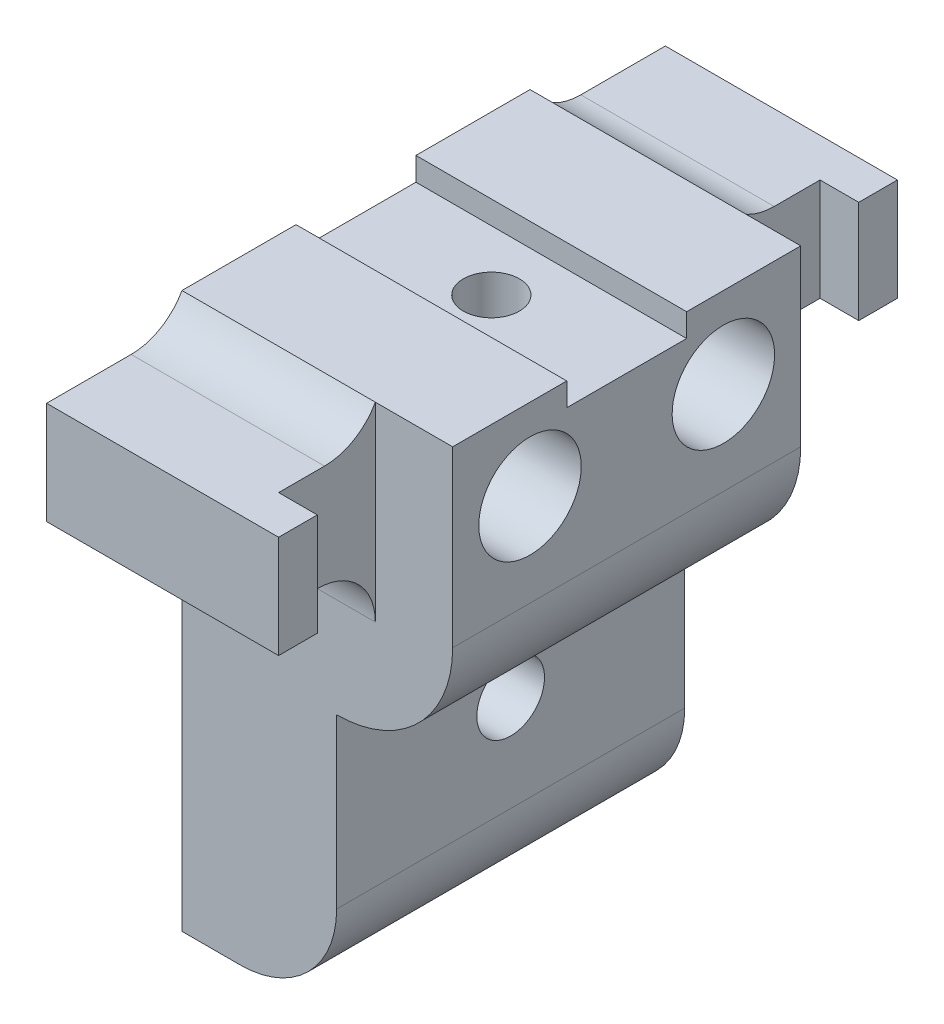
ISO-10303-21;
HEADER;
FILE_DESCRIPTION(('STEP AP214'),'2;1');
FILE_NAME('part.step','',(''),(''),'','','');
FILE_SCHEMA(('AUTOMOTIVE_DESIGN { 1 0 10303 214 1 1 1 1 }'));
ENDSEC;
DATA;
#1=APPLICATION_CONTEXT('core data for automotive mechanical design processes');
#2=APPLICATION_PROTOCOL_DEFINITION('international standard','automotive_design',2000,#1);
#3=PRODUCT_CONTEXT('',#1,'mechanical');
#4=PRODUCT('Part','Part','',(#3));
#5=PRODUCT_RELATED_PRODUCT_CATEGORY('part','',(#4));
#6=PRODUCT_DEFINITION_FORMATION('','',#4);
#7=PRODUCT_DEFINITION_CONTEXT('part definition',#1,'design');
#8=PRODUCT_DEFINITION('design','',#6,#7);
#9=PRODUCT_DEFINITION_SHAPE('','',#8);
#10=(LENGTH_UNIT() NAMED_UNIT(*) SI_UNIT(.MILLI.,.METRE.));
#11=(NAMED_UNIT(*) PLANE_ANGLE_UNIT() SI_UNIT($,.RADIAN.));
#12=(NAMED_UNIT(*) SI_UNIT($,.STERADIAN.) SOLID_ANGLE_UNIT());
#13=UNCERTAINTY_MEASURE_WITH_UNIT(LENGTH_MEASURE(1.E-05),#10,'distance_accuracy_value','');
#14=(GEOMETRIC_REPRESENTATION_CONTEXT(3) GLOBAL_UNCERTAINTY_ASSIGNED_CONTEXT((#13)) GLOBAL_UNIT_ASSIGNED_CONTEXT((#10,
#11,#12)) REPRESENTATION_CONTEXT('',''));
#15=CARTESIAN_POINT('',(0.,0.,0.));
#16=DIRECTION('',(0.,0.,1.));
#17=DIRECTION('',(1.,0.,0.));
#18=AXIS2_PLACEMENT_3D('',#15,#16,#17);
#19=CARTESIAN_POINT('',(0.,0.,9.));
#20=DIRECTION('',(0.,1.,0.));
#21=DIRECTION('',(0.,0.,1.));
#22=AXIS2_PLACEMENT_3D('',#19,#20,#21);
#23=PLANE('',#22);
#24=DIRECTION('',(-1.,0.,0.));
#25=VECTOR('',#24,1.);
#26=CARTESIAN_POINT('',(0.,0.,-3.1));
#27=LINE('',#26,#25);
#28=CARTESIAN_POINT('',(14.,0.,-3.1));
#29=VERTEX_POINT('',#28);
#30=CARTESIAN_POINT('',(0.,0.,-3.1));
#31=VERTEX_POINT('',#30);
#32=EDGE_CURVE('E235',#29,#31,#27,.T.);
#33=ORIENTED_EDGE('',*,*,#32,.F.);
#34=DIRECTION('',(0.,0.,-1.));
#35=VECTOR('',#34,1.);
#36=CARTESIAN_POINT('',(14.,0.,9.));
#37=LINE('',#36,#35);
#38=CARTESIAN_POINT('',(14.,0.,-9.));
#39=VERTEX_POINT('',#38);
#40=EDGE_CURVE('E428',#29,#39,#37,.T.);
#41=ORIENTED_EDGE('',*,*,#40,.T.);
#42=DIRECTION('',(1.,0.,0.));
#43=VECTOR('',#42,1.);
#44=CARTESIAN_POINT('',(0.,0.,-9.));
#45=LINE('',#44,#43);
#46=CARTESIAN_POINT('',(10.,0.,-9.));
#47=VERTEX_POINT('',#46);
#48=EDGE_CURVE('E403',#47,#39,#45,.T.);
#49=ORIENTED_EDGE('',*,*,#48,.F.);
#50=CARTESIAN_POINT('',(0.,0.,-9.));
#51=VERTEX_POINT('',#50);
#52=EDGE_CURVE('E404',#51,#47,#45,.T.);
#53=ORIENTED_EDGE('',*,*,#52,.F.);
#54=DIRECTION('',(0.,0.,-1.));
#55=VECTOR('',#54,1.);
#56=CARTESIAN_POINT('',(0.,0.,9.));
#57=LINE('',#56,#55);
#58=EDGE_CURVE('E425',#31,#51,#57,.T.);
#59=ORIENTED_EDGE('',*,*,#58,.F.);
#60=EDGE_LOOP('',(#33,#41,#49,#53,#59));
#61=FACE_BOUND('',#60,.T.);
#62=ADVANCED_FACE('F41',(#61),#23,.T.);
#63=CARTESIAN_POINT('',(14.,0.,9.));
#64=DIRECTION('',(1.,0.,0.));
#65=DIRECTION('',(0.,1.,0.));
#66=AXIS2_PLACEMENT_3D('',#63,#64,#65);
#67=PLANE('',#66);
#68=DIRECTION('',(0.,-1.,0.));
#69=VECTOR('',#68,1.);
#70=CARTESIAN_POINT('',(14.,0.,9.));
#71=LINE('',#70,#69);
#72=CARTESIAN_POINT('',(14.,0.,9.));
#73=VERTEX_POINT('',#72);
#74=CARTESIAN_POINT('',(14.,-9.,9.));
#75=VERTEX_POINT('',#74);
#76=EDGE_CURVE('E378',#73,#75,#71,.T.);
#77=ORIENTED_EDGE('',*,*,#76,.T.);
#78=DIRECTION('',(0.,0.,-1.));
#79=VECTOR('',#78,1.);
#80=CARTESIAN_POINT('',(14.,-9.,-9.));
#81=LINE('',#80,#79);
#82=CARTESIAN_POINT('',(14.,-9.,-9.));
#83=VERTEX_POINT('',#82);
#84=EDGE_CURVE('E451',#75,#83,#81,.T.);
#85=ORIENTED_EDGE('',*,*,#84,.T.);
#86=DIRECTION('',(0.,-1.,0.));
#87=VECTOR('',#86,1.);
#88=CARTESIAN_POINT('',(14.,0.,-9.));
#89=LINE('',#88,#87);
#90=EDGE_CURVE('E366',#39,#83,#89,.T.);
#91=ORIENTED_EDGE('',*,*,#90,.F.);
#92=ORIENTED_EDGE('',*,*,#40,.F.);
#93=DIRECTION('',(0.,1.,0.));
#94=VECTOR('',#93,1.);
#95=CARTESIAN_POINT('',(14.,-1.2,-3.1));
#96=LINE('',#95,#94);
#97=CARTESIAN_POINT('',(14.,-1.2,-3.1));
#98=VERTEX_POINT('',#97);
#99=EDGE_CURVE('E245',#98,#29,#96,.T.);
#100=ORIENTED_EDGE('',*,*,#99,.F.);
#101=DIRECTION('',(0.,0.,-1.));
#102=VECTOR('',#101,1.);
#103=CARTESIAN_POINT('',(14.,-1.2,-3.1));
#104=LINE('',#103,#102);
#105=CARTESIAN_POINT('',(14.,-1.2,3.1));
#106=VERTEX_POINT('',#105);
#107=EDGE_CURVE('E225',#106,#98,#104,.T.);
#108=ORIENTED_EDGE('',*,*,#107,.F.);
#109=DIRECTION('',(0.,1.,0.));
#110=VECTOR('',#109,1.);
#111=CARTESIAN_POINT('',(14.,-1.2,3.1));
#112=LINE('',#111,#110);
#113=CARTESIAN_POINT('',(14.,0.,3.1));
#114=VERTEX_POINT('',#113);
#115=EDGE_CURVE('E221',#106,#114,#112,.T.);
#116=ORIENTED_EDGE('',*,*,#115,.T.);
#117=EDGE_CURVE('E429',#73,#114,#37,.T.);
#118=ORIENTED_EDGE('',*,*,#117,.F.);
#119=EDGE_LOOP('',(#77,#85,#91,#92,#100,#108,#116,#118));
#120=FACE_BOUND('',#119,.T.);
#121=CARTESIAN_POINT('',(14.,-4.2,-5.));
#122=DIRECTION('',(1.,0.,0.));
#123=DIRECTION('',(0.,1.,0.));
#124=AXIS2_PLACEMENT_3D('',#121,#122,#123);
#125=CIRCLE('',#124,2.65);
#126=CARTESIAN_POINT('',(14.,-1.55,-5.));
#127=VERTEX_POINT('',#126);
#128=EDGE_CURVE('E367',#127,#127,#125,.T.);
#129=ORIENTED_EDGE('',*,*,#128,.F.);
#130=EDGE_LOOP('',(#129));
#131=FACE_BOUND('',#130,.T.);
#132=CARTESIAN_POINT('',(14.,-4.2,5.));
#133=DIRECTION('',(1.,0.,0.));
#134=DIRECTION('',(0.,1.,0.));
#135=AXIS2_PLACEMENT_3D('',#132,#133,#134);
#136=CIRCLE('',#135,2.65);
#137=CARTESIAN_POINT('',(14.,-1.55,5.));
#138=VERTEX_POINT('',#137);
#139=EDGE_CURVE('E361',#138,#138,#136,.T.);
#140=ORIENTED_EDGE('',*,*,#139,.F.);
#141=EDGE_LOOP('',(#140));
#142=FACE_BOUND('',#141,.T.);
#143=ADVANCED_FACE('F529',(#120,#131,#142),#67,.T.);
#144=DIRECTION('',(1.,0.,0.));
#145=VECTOR('',#144,1.);
#146=CARTESIAN_POINT('',(0.,0.,3.1));
#147=LINE('',#146,#145);
#148=CARTESIAN_POINT('',(0.,0.,3.1));
#149=VERTEX_POINT('',#148);
#150=EDGE_CURVE('E887',#149,#114,#147,.T.);
#151=ORIENTED_EDGE('',*,*,#150,.F.);
#152=CARTESIAN_POINT('',(0.,0.,9.));
#153=VERTEX_POINT('',#152);
#154=EDGE_CURVE('E240',#153,#149,#57,.T.);
#155=ORIENTED_EDGE('',*,*,#154,.F.);
#156=DIRECTION('',(1.,0.,0.));
#157=VECTOR('',#156,1.);
#158=CARTESIAN_POINT('',(0.,0.,9.));
#159=LINE('',#158,#157);
#160=CARTESIAN_POINT('',(10.,0.,9.));
#161=VERTEX_POINT('',#160);
#162=EDGE_CURVE('E384',#153,#161,#159,.T.);
#163=ORIENTED_EDGE('',*,*,#162,.T.);
#164=EDGE_CURVE('E382',#161,#73,#159,.T.);
#165=ORIENTED_EDGE('',*,*,#164,.T.);
#166=ORIENTED_EDGE('',*,*,#117,.T.);
#167=EDGE_LOOP('',(#151,#155,#163,#165,#166));
#168=FACE_BOUND('',#167,.T.);
#169=ADVANCED_FACE('F538',(#168),#23,.T.);
#170=CARTESIAN_POINT('',(0.,0.,9.));
#171=DIRECTION('',(1.,0.,0.));
#172=DIRECTION('',(0.,1.,0.));
#173=AXIS2_PLACEMENT_3D('',#170,#171,#172);
#174=PLANE('',#173);
#175=CARTESIAN_POINT('',(0.,-18.7,0.));
#176=DIRECTION('',(1.,0.,0.));
#177=DIRECTION('',(0.,1.,0.));
#178=AXIS2_PLACEMENT_3D('',#175,#176,#177);
#179=CIRCLE('',#178,1.75);
#180=CARTESIAN_POINT('',(0.,-16.95,0.));
#181=VERTEX_POINT('',#180);
#182=EDGE_CURVE('E438',#181,#181,#179,.T.);
#183=ORIENTED_EDGE('',*,*,#182,.T.);
#184=EDGE_LOOP('',(#183));
#185=FACE_BOUND('',#184,.T.);
#186=CARTESIAN_POINT('',(0.,-4.2,-5.));
#187=DIRECTION('',(1.,0.,0.));
#188=DIRECTION('',(0.,1.,0.));
#189=AXIS2_PLACEMENT_3D('',#186,#187,#188);
#190=CIRCLE('',#189,2.65);
#191=CARTESIAN_POINT('',(0.,-1.55,-5.));
#192=VERTEX_POINT('',#191);
#193=EDGE_CURVE('E362',#192,#192,#190,.T.);
#194=ORIENTED_EDGE('',*,*,#193,.T.);
#195=EDGE_LOOP('',(#194));
#196=FACE_BOUND('',#195,.T.);
#197=CARTESIAN_POINT('',(0.,-4.2,5.));
#198=DIRECTION('',(1.,0.,0.));
#199=DIRECTION('',(0.,1.,0.));
#200=AXIS2_PLACEMENT_3D('',#197,#198,#199);
#201=CIRCLE('',#200,2.65);
#202=CARTESIAN_POINT('',(0.,-1.55,5.));
#203=VERTEX_POINT('',#202);
#204=EDGE_CURVE('E371',#203,#203,#201,.T.);
#205=ORIENTED_EDGE('',*,*,#204,.T.);
#206=EDGE_LOOP('',(#205));
#207=FACE_BOUND('',#206,.T.);
#208=DIRECTION('',(0.,0.,1.));
#209=VECTOR('',#208,1.);
#210=CARTESIAN_POINT('',(0.,-1.2,-3.1));
#211=LINE('',#210,#209);
#212=CARTESIAN_POINT('',(0.,-1.2,-3.1));
#213=VERTEX_POINT('',#212);
#214=CARTESIAN_POINT('',(0.,-1.2,3.1));
#215=VERTEX_POINT('',#214);
#216=EDGE_CURVE('E226',#213,#215,#211,.T.);
#217=ORIENTED_EDGE('',*,*,#216,.F.);
#218=DIRECTION('',(0.,1.,0.));
#219=VECTOR('',#218,1.);
#220=CARTESIAN_POINT('',(0.,-1.2,-3.1));
#221=LINE('',#220,#219);
#222=EDGE_CURVE('E272',#213,#31,#221,.T.);
#223=ORIENTED_EDGE('',*,*,#222,.T.);
#224=ORIENTED_EDGE('',*,*,#58,.T.);
#225=CARTESIAN_POINT('',(0.,1.45,-11.6263091973338));
#226=DIRECTION('',(1.,0.,0.));
#227=DIRECTION('',(0.,1.,0.));
#228=AXIS2_PLACEMENT_3D('',#225,#226,#227);
#229=CIRCLE('',#228,3.);
#230=CARTESIAN_POINT('',(0.,-1.55,-11.6263091973338));
#231=VERTEX_POINT('',#230);
#232=EDGE_CURVE('E481',#51,#231,#229,.T.);
#233=ORIENTED_EDGE('',*,*,#232,.T.);
#234=DIRECTION('',(0.,0.,1.));
#235=VECTOR('',#234,1.);
#236=CARTESIAN_POINT('',(0.,-1.55,-14.));
#237=LINE('',#236,#235);
#238=CARTESIAN_POINT('',(0.,-1.55,-16.));
#239=VERTEX_POINT('',#238);
#240=EDGE_CURVE('E303',#239,#231,#237,.T.);
#241=ORIENTED_EDGE('',*,*,#240,.F.);
#242=DIRECTION('',(0.,-1.,0.));
#243=VECTOR('',#242,1.);
#244=CARTESIAN_POINT('',(0.,-1.55,-16.));
#245=LINE('',#244,#243);
#246=CARTESIAN_POINT('',(0.,-6.85,-16.));
#247=VERTEX_POINT('',#246);
#248=EDGE_CURVE('E250',#239,#247,#245,.T.);
#249=ORIENTED_EDGE('',*,*,#248,.T.);
#250=DIRECTION('',(0.,0.,1.));
#251=VECTOR('',#250,1.);
#252=CARTESIAN_POINT('',(0.,-6.85,-14.));
#253=LINE('',#252,#251);
#254=CARTESIAN_POINT('',(0.,-6.85,-12.));
#255=VERTEX_POINT('',#254);
#256=EDGE_CURVE('E289',#247,#255,#253,.T.);
#257=ORIENTED_EDGE('',*,*,#256,.T.);
#258=CARTESIAN_POINT('',(0.,-9.85,-12.));
#259=DIRECTION('',(1.,0.,0.));
#260=DIRECTION('',(0.,1.,0.));
#261=AXIS2_PLACEMENT_3D('',#258,#259,#260);
#262=CIRCLE('',#261,3.);
#263=CARTESIAN_POINT('',(0.,-9.85,-9.));
#264=VERTEX_POINT('',#263);
#265=EDGE_CURVE('E491',#255,#264,#262,.T.);
#266=ORIENTED_EDGE('',*,*,#265,.T.);
#267=DIRECTION('',(0.,-1.,0.));
#268=VECTOR('',#267,1.);
#269=CARTESIAN_POINT('',(0.,0.,-9.));
#270=LINE('',#269,#268);
#271=CARTESIAN_POINT('',(0.,-28.7,-9.));
#272=VERTEX_POINT('',#271);
#273=EDGE_CURVE('E408',#264,#272,#270,.T.);
#274=ORIENTED_EDGE('',*,*,#273,.T.);
#275=DIRECTION('',(0.,0.,-1.));
#276=VECTOR('',#275,1.);
#277=CARTESIAN_POINT('',(0.,-28.7,9.));
#278=LINE('',#277,#276);
#279=CARTESIAN_POINT('',(0.,-28.7,9.));
#280=VERTEX_POINT('',#279);
#281=EDGE_CURVE('E421',#280,#272,#278,.T.);
#282=ORIENTED_EDGE('',*,*,#281,.F.);
#283=DIRECTION('',(0.,-1.,0.));
#284=VECTOR('',#283,1.);
#285=CARTESIAN_POINT('',(0.,0.,9.));
#286=LINE('',#285,#284);
#287=CARTESIAN_POINT('',(0.,-9.85,9.));
#288=VERTEX_POINT('',#287);
#289=EDGE_CURVE('E388',#288,#280,#286,.T.);
#290=ORIENTED_EDGE('',*,*,#289,.F.);
#291=CARTESIAN_POINT('',(0.,-9.85,12.));
#292=DIRECTION('',(1.,0.,0.));
#293=DIRECTION('',(0.,1.,0.));
#294=AXIS2_PLACEMENT_3D('',#291,#292,#293);
#295=CIRCLE('',#294,3.);
#296=CARTESIAN_POINT('',(0.,-6.85,12.));
#297=VERTEX_POINT('',#296);
#298=EDGE_CURVE('E11',#288,#297,#295,.T.);
#299=ORIENTED_EDGE('',*,*,#298,.T.);
#300=DIRECTION('',(0.,0.,-1.));
#301=VECTOR('',#300,1.);
#302=CARTESIAN_POINT('',(0.,-6.85,14.));
#303=LINE('',#302,#301);
#304=CARTESIAN_POINT('',(0.,-6.85,16.));
#305=VERTEX_POINT('',#304);
#306=EDGE_CURVE('E358',#305,#297,#303,.T.);
#307=ORIENTED_EDGE('',*,*,#306,.F.);
#308=DIRECTION('',(0.,-1.,0.));
#309=VECTOR('',#308,1.);
#310=CARTESIAN_POINT('',(0.,-1.55,16.));
#311=LINE('',#310,#309);
#312=CARTESIAN_POINT('',(0.,-1.55,16.));
#313=VERTEX_POINT('',#312);
#314=EDGE_CURVE('E308',#313,#305,#311,.T.);
#315=ORIENTED_EDGE('',*,*,#314,.F.);
#316=DIRECTION('',(0.,0.,-1.));
#317=VECTOR('',#316,1.);
#318=CARTESIAN_POINT('',(0.,-1.55,14.));
#319=LINE('',#318,#317);
#320=CARTESIAN_POINT('',(0.,-1.55,11.6263091973338));
#321=VERTEX_POINT('',#320);
#322=EDGE_CURVE('E344',#313,#321,#319,.T.);
#323=ORIENTED_EDGE('',*,*,#322,.T.);
#324=CARTESIAN_POINT('',(0.,1.45,11.6263091973338));
#325=DIRECTION('',(1.,0.,0.));
#326=DIRECTION('',(0.,1.,0.));
#327=AXIS2_PLACEMENT_3D('',#324,#325,#326);
#328=CIRCLE('',#327,3.);
#329=EDGE_CURVE('E494',#321,#153,#328,.T.);
#330=ORIENTED_EDGE('',*,*,#329,.T.);
#331=ORIENTED_EDGE('',*,*,#154,.T.);
#332=DIRECTION('',(0.,1.,0.));
#333=VECTOR('',#332,1.);
#334=CARTESIAN_POINT('',(0.,-1.2,3.1));
#335=LINE('',#334,#333);
#336=EDGE_CURVE('E218',#215,#149,#335,.T.);
#337=ORIENTED_EDGE('',*,*,#336,.F.);
#338=EDGE_LOOP('',(#217,#223,#224,#233,#241,#249,#257,#266,#274,#282,#290,#299,#307,#315,#323,
#330,#331,#337));
#339=FACE_BOUND('',#338,.T.);
#340=ADVANCED_FACE('F238',(#185,#196,#207,#339),#174,.F.);
#341=CARTESIAN_POINT('',(0.,-28.7,9.));
#342=DIRECTION('',(0.,1.,0.));
#343=DIRECTION('',(0.,0.,1.));
#344=AXIS2_PLACEMENT_3D('',#341,#342,#343);
#345=PLANE('',#344);
#346=DIRECTION('',(1.,0.,0.));
#347=VECTOR('',#346,1.);
#348=CARTESIAN_POINT('',(0.,-28.7,-9.));
#349=LINE('',#348,#347);
#350=CARTESIAN_POINT('',(3.,-28.7,-9.));
#351=VERTEX_POINT('',#350);
#352=EDGE_CURVE('E411',#272,#351,#349,.T.);
#353=ORIENTED_EDGE('',*,*,#352,.T.);
#354=DIRECTION('',(0.,0.,-1.));
#355=VECTOR('',#354,1.);
#356=CARTESIAN_POINT('',(3.,-28.7,9.));
#357=LINE('',#356,#355);
#358=CARTESIAN_POINT('',(3.,-28.7,9.));
#359=VERTEX_POINT('',#358);
#360=EDGE_CURVE('E445',#351,#359,#357,.F.);
#361=ORIENTED_EDGE('',*,*,#360,.T.);
#362=DIRECTION('',(1.,0.,0.));
#363=VECTOR('',#362,1.);
#364=CARTESIAN_POINT('',(0.,-28.7,9.));
#365=LINE('',#364,#363);
#366=EDGE_CURVE('E391',#280,#359,#365,.T.);
#367=ORIENTED_EDGE('',*,*,#366,.F.);
#368=ORIENTED_EDGE('',*,*,#281,.T.);
#369=EDGE_LOOP('',(#353,#361,#367,#368));
#370=FACE_BOUND('',#369,.T.);
#371=ADVANCED_FACE('F511',(#370),#345,.F.);
#372=CARTESIAN_POINT('',(8.,0.,9.));
#373=DIRECTION('',(1.,0.,0.));
#374=DIRECTION('',(0.,1.,0.));
#375=AXIS2_PLACEMENT_3D('',#372,#373,#374);
#376=PLANE('',#375);
#377=CARTESIAN_POINT('',(8.,-18.7,0.));
#378=DIRECTION('',(1.,0.,0.));
#379=DIRECTION('',(0.,1.,0.));
#380=AXIS2_PLACEMENT_3D('',#377,#378,#379);
#381=CIRCLE('',#380,1.75);
#382=CARTESIAN_POINT('',(8.,-16.95,0.));
#383=VERTEX_POINT('',#382);
#384=EDGE_CURVE('E434',#383,#383,#381,.T.);
#385=ORIENTED_EDGE('',*,*,#384,.F.);
#386=EDGE_LOOP('',(#385));
#387=FACE_BOUND('',#386,.T.);
#388=DIRECTION('',(0.,-1.,0.));
#389=VECTOR('',#388,1.);
#390=CARTESIAN_POINT('',(8.,0.,9.));
#391=LINE('',#390,#389);
#392=CARTESIAN_POINT('',(8.,-15.,9.));
#393=VERTEX_POINT('',#392);
#394=CARTESIAN_POINT('',(8.,-23.7,9.));
#395=VERTEX_POINT('',#394);
#396=EDGE_CURVE('E395',#393,#395,#391,.T.);
#397=ORIENTED_EDGE('',*,*,#396,.T.);
#398=DIRECTION('',(0.,0.,-1.));
#399=VECTOR('',#398,1.);
#400=CARTESIAN_POINT('',(8.,-23.7,-9.));
#401=LINE('',#400,#399);
#402=CARTESIAN_POINT('',(8.,-23.7,-9.));
#403=VERTEX_POINT('',#402);
#404=EDGE_CURVE('E433',#395,#403,#401,.T.);
#405=ORIENTED_EDGE('',*,*,#404,.T.);
#406=DIRECTION('',(0.,-1.,0.));
#407=VECTOR('',#406,1.);
#408=CARTESIAN_POINT('',(8.,0.,-9.));
#409=LINE('',#408,#407);
#410=CARTESIAN_POINT('',(8.,-15.,-9.));
#411=VERTEX_POINT('',#410);
#412=EDGE_CURVE('E383',#411,#403,#409,.T.);
#413=ORIENTED_EDGE('',*,*,#412,.F.);
#414=DIRECTION('',(0.,0.,-1.));
#415=VECTOR('',#414,1.);
#416=CARTESIAN_POINT('',(8.,-15.,9.));
#417=LINE('',#416,#415);
#418=EDGE_CURVE('E399',#393,#411,#417,.T.);
#419=ORIENTED_EDGE('',*,*,#418,.F.);
#420=EDGE_LOOP('',(#397,#405,#413,#419));
#421=FACE_BOUND('',#420,.T.);
#422=ADVANCED_FACE('F520',(#387,#421),#376,.T.);
#423=CARTESIAN_POINT('',(0.,0.,9.));
#424=DIRECTION('',(0.,0.,1.));
#425=DIRECTION('',(1.,0.,0.));
#426=AXIS2_PLACEMENT_3D('',#423,#424,#425);
#427=PLANE('',#426);
#428=ORIENTED_EDGE('',*,*,#164,.F.);
#429=DIRECTION('',(0.,1.,0.));
#430=VECTOR('',#429,1.);
#431=CARTESIAN_POINT('',(10.,-1.55,9.));
#432=LINE('',#431,#430);
#433=CARTESIAN_POINT('',(10.,-9.85,9.));
#434=VERTEX_POINT('',#433);
#435=EDGE_CURVE('E339',#434,#161,#432,.T.);
#436=ORIENTED_EDGE('',*,*,#435,.F.);
#437=DIRECTION('',(1.,0.,0.));
#438=VECTOR('',#437,1.);
#439=CARTESIAN_POINT('',(0.,-9.85,9.));
#440=LINE('',#439,#438);
#441=EDGE_CURVE('E475',#434,#288,#440,.F.);
#442=ORIENTED_EDGE('',*,*,#441,.T.);
#443=ORIENTED_EDGE('',*,*,#289,.T.);
#444=ORIENTED_EDGE('',*,*,#366,.T.);
#445=CARTESIAN_POINT('',(3.,-23.7,9.));
#446=DIRECTION('',(0.,0.,1.));
#447=DIRECTION('',(1.,0.,0.));
#448=AXIS2_PLACEMENT_3D('',#445,#446,#447);
#449=CIRCLE('',#448,5.);
#450=EDGE_CURVE('E448',#359,#395,#449,.T.);
#451=ORIENTED_EDGE('',*,*,#450,.T.);
#452=ORIENTED_EDGE('',*,*,#396,.F.);
#453=CARTESIAN_POINT('',(8.,-9.,9.));
#454=DIRECTION('',(0.,0.,1.));
#455=DIRECTION('',(1.,0.,0.));
#456=AXIS2_PLACEMENT_3D('',#453,#454,#455);
#457=CIRCLE('',#456,6.);
#458=EDGE_CURVE('E458',#393,#75,#457,.T.);
#459=ORIENTED_EDGE('',*,*,#458,.T.);
#460=ORIENTED_EDGE('',*,*,#76,.F.);
#461=EDGE_LOOP('',(#428,#436,#442,#443,#444,#451,#452,#459,#460));
#462=FACE_BOUND('',#461,.T.);
#463=ADVANCED_FACE('F505',(#462),#427,.T.);
#464=CARTESIAN_POINT('',(0.,0.,-9.));
#465=DIRECTION('',(0.,0.,1.));
#466=DIRECTION('',(1.,0.,0.));
#467=AXIS2_PLACEMENT_3D('',#464,#465,#466);
#468=PLANE('',#467);
#469=DIRECTION('',(0.,1.,0.));
#470=VECTOR('',#469,1.);
#471=CARTESIAN_POINT('',(10.,-1.55,-9.));
#472=LINE('',#471,#470);
#473=CARTESIAN_POINT('',(10.,-9.85,-9.));
#474=VERTEX_POINT('',#473);
#475=EDGE_CURVE('E284',#474,#47,#472,.T.);
#476=ORIENTED_EDGE('',*,*,#475,.T.);
#477=ORIENTED_EDGE('',*,*,#48,.T.);
#478=ORIENTED_EDGE('',*,*,#90,.T.);
#479=CARTESIAN_POINT('',(8.,-9.,-9.));
#480=DIRECTION('',(0.,0.,1.));
#481=DIRECTION('',(1.,0.,0.));
#482=AXIS2_PLACEMENT_3D('',#479,#480,#481);
#483=CIRCLE('',#482,6.);
#484=EDGE_CURVE('E455',#83,#411,#483,.F.);
#485=ORIENTED_EDGE('',*,*,#484,.T.);
#486=ORIENTED_EDGE('',*,*,#412,.T.);
#487=CARTESIAN_POINT('',(3.,-23.7,-9.));
#488=DIRECTION('',(0.,0.,1.));
#489=DIRECTION('',(1.,0.,0.));
#490=AXIS2_PLACEMENT_3D('',#487,#488,#489);
#491=CIRCLE('',#490,5.);
#492=EDGE_CURVE('E442',#403,#351,#491,.F.);
#493=ORIENTED_EDGE('',*,*,#492,.T.);
#494=ORIENTED_EDGE('',*,*,#352,.F.);
#495=ORIENTED_EDGE('',*,*,#273,.F.);
#496=DIRECTION('',(1.,0.,0.));
#497=VECTOR('',#496,1.);
#498=CARTESIAN_POINT('',(0.,-9.85,-9.));
#499=LINE('',#498,#497);
#500=EDGE_CURVE('E461',#264,#474,#499,.T.);
#501=ORIENTED_EDGE('',*,*,#500,.T.);
#502=EDGE_LOOP('',(#476,#477,#478,#485,#486,#493,#494,#495,#501));
#503=FACE_BOUND('',#502,.T.);
#504=ADVANCED_FACE('F522',(#503),#468,.F.);
#505=CARTESIAN_POINT('',(0.,-4.2,5.));
#506=DIRECTION('',(1.,0.,0.));
#507=DIRECTION('',(0.,1.,0.));
#508=AXIS2_PLACEMENT_3D('',#505,#506,#507);
#509=CYLINDRICAL_SURFACE('',#508,2.65);
#510=ORIENTED_EDGE('',*,*,#204,.F.);
#511=EDGE_LOOP('',(#510));
#512=FACE_BOUND('',#511,.T.);
#513=ORIENTED_EDGE('',*,*,#139,.T.);
#514=EDGE_LOOP('',(#513));
#515=FACE_BOUND('',#514,.T.);
#516=ADVANCED_FACE('F599',(#512,#515),#509,.F.);
#517=CARTESIAN_POINT('',(0.,-4.2,-5.));
#518=DIRECTION('',(1.,0.,0.));
#519=DIRECTION('',(0.,1.,0.));
#520=AXIS2_PLACEMENT_3D('',#517,#518,#519);
#521=CYLINDRICAL_SURFACE('',#520,2.65);
#522=ORIENTED_EDGE('',*,*,#193,.F.);
#523=EDGE_LOOP('',(#522));
#524=FACE_BOUND('',#523,.T.);
#525=ORIENTED_EDGE('',*,*,#128,.T.);
#526=EDGE_LOOP('',(#525));
#527=FACE_BOUND('',#526,.T.);
#528=ADVANCED_FACE('F604',(#524,#527),#521,.F.);
#529=CARTESIAN_POINT('',(0.,-6.85,14.));
#530=DIRECTION('',(0.,1.,0.));
#531=DIRECTION('',(0.,0.,1.));
#532=AXIS2_PLACEMENT_3D('',#529,#530,#531);
#533=PLANE('',#532);
#534=ORIENTED_EDGE('',*,*,#306,.T.);
#535=DIRECTION('',(1.,0.,0.));
#536=VECTOR('',#535,1.);
#537=CARTESIAN_POINT('',(0.,-6.85,12.));
#538=LINE('',#537,#536);
#539=CARTESIAN_POINT('',(10.,-6.85,12.));
#540=VERTEX_POINT('',#539);
#541=EDGE_CURVE('E478',#297,#540,#538,.T.);
#542=ORIENTED_EDGE('',*,*,#541,.T.);
#543=DIRECTION('',(0.,0.,-1.));
#544=VECTOR('',#543,1.);
#545=CARTESIAN_POINT('',(10.,-6.85,14.));
#546=LINE('',#545,#544);
#547=CARTESIAN_POINT('',(10.,-6.85,14.));
#548=VERTEX_POINT('',#547);
#549=EDGE_CURVE('E354',#548,#540,#546,.T.);
#550=ORIENTED_EDGE('',*,*,#549,.F.);
#551=DIRECTION('',(1.,0.,0.));
#552=VECTOR('',#551,1.);
#553=CARTESIAN_POINT('',(0.,-6.85,14.));
#554=LINE('',#553,#552);
#555=CARTESIAN_POINT('',(12.,-6.85,14.));
#556=VERTEX_POINT('',#555);
#557=EDGE_CURVE('E307',#548,#556,#554,.T.);
#558=ORIENTED_EDGE('',*,*,#557,.T.);
#559=DIRECTION('',(0.,0.,-1.));
#560=VECTOR('',#559,1.);
#561=CARTESIAN_POINT('',(12.,-6.85,16.));
#562=LINE('',#561,#560);
#563=CARTESIAN_POINT('',(12.,-6.85,16.));
#564=VERTEX_POINT('',#563);
#565=EDGE_CURVE('E335',#564,#556,#562,.T.);
#566=ORIENTED_EDGE('',*,*,#565,.F.);
#567=DIRECTION('',(1.,0.,0.));
#568=VECTOR('',#567,1.);
#569=CARTESIAN_POINT('',(0.,-6.85,16.));
#570=LINE('',#569,#568);
#571=EDGE_CURVE('E312',#305,#564,#570,.T.);
#572=ORIENTED_EDGE('',*,*,#571,.F.);
#573=EDGE_LOOP('',(#534,#542,#550,#558,#566,#572));
#574=FACE_BOUND('',#573,.T.);
#575=ADVANCED_FACE('F553',(#574),#533,.F.);
#576=CARTESIAN_POINT('',(10.,-1.55,14.));
#577=DIRECTION('',(-1.,0.,0.));
#578=DIRECTION('',(0.,0.,1.));
#579=AXIS2_PLACEMENT_3D('',#576,#577,#578);
#580=PLANE('',#579);
#581=ORIENTED_EDGE('',*,*,#435,.T.);
#582=CARTESIAN_POINT('',(10.,1.45,11.6263091973338));
#583=DIRECTION('',(-1.,0.,0.));
#584=DIRECTION('',(0.,0.,1.));
#585=AXIS2_PLACEMENT_3D('',#582,#583,#584);
#586=CIRCLE('',#585,3.);
#587=CARTESIAN_POINT('',(10.,-1.55,11.6263091973338));
#588=VERTEX_POINT('',#587);
#589=EDGE_CURVE('E497',#161,#588,#586,.T.);
#590=ORIENTED_EDGE('',*,*,#589,.T.);
#591=DIRECTION('',(0.,0.,-1.));
#592=VECTOR('',#591,1.);
#593=CARTESIAN_POINT('',(10.,-1.55,14.));
#594=LINE('',#593,#592);
#595=CARTESIAN_POINT('',(10.,-1.55,14.));
#596=VERTEX_POINT('',#595);
#597=EDGE_CURVE('E350',#596,#588,#594,.T.);
#598=ORIENTED_EDGE('',*,*,#597,.F.);
#599=DIRECTION('',(0.,1.,0.));
#600=VECTOR('',#599,1.);
#601=CARTESIAN_POINT('',(10.,-1.55,14.));
#602=LINE('',#601,#600);
#603=EDGE_CURVE('E340',#548,#596,#602,.T.);
#604=ORIENTED_EDGE('',*,*,#603,.F.);
#605=ORIENTED_EDGE('',*,*,#549,.T.);
#606=CARTESIAN_POINT('',(10.,-9.85,12.));
#607=DIRECTION('',(-1.,0.,0.));
#608=DIRECTION('',(0.,0.,1.));
#609=AXIS2_PLACEMENT_3D('',#606,#607,#608);
#610=CIRCLE('',#609,3.);
#611=EDGE_CURVE('E50',#540,#434,#610,.T.);
#612=ORIENTED_EDGE('',*,*,#611,.T.);
#613=EDGE_LOOP('',(#581,#590,#598,#604,#605,#612));
#614=FACE_BOUND('',#613,.T.);
#615=ADVANCED_FACE('F501',(#614),#580,.F.);
#616=CARTESIAN_POINT('',(0.,-1.55,14.));
#617=DIRECTION('',(0.,-1.,0.));
#618=DIRECTION('',(0.,0.,-1.));
#619=AXIS2_PLACEMENT_3D('',#616,#617,#618);
#620=PLANE('',#619);
#621=ORIENTED_EDGE('',*,*,#597,.T.);
#622=DIRECTION('',(-1.,0.,0.));
#623=VECTOR('',#622,1.);
#624=CARTESIAN_POINT('',(0.,-1.55,11.6263091973338));
#625=LINE('',#624,#623);
#626=EDGE_CURVE('E471',#588,#321,#625,.T.);
#627=ORIENTED_EDGE('',*,*,#626,.T.);
#628=ORIENTED_EDGE('',*,*,#322,.F.);
#629=DIRECTION('',(-1.,0.,0.));
#630=VECTOR('',#629,1.);
#631=CARTESIAN_POINT('',(0.,-1.55,16.));
#632=LINE('',#631,#630);
#633=CARTESIAN_POINT('',(12.,-1.55,16.));
#634=VERTEX_POINT('',#633);
#635=EDGE_CURVE('E319',#634,#313,#632,.T.);
#636=ORIENTED_EDGE('',*,*,#635,.F.);
#637=DIRECTION('',(0.,0.,-1.));
#638=VECTOR('',#637,1.);
#639=CARTESIAN_POINT('',(12.,-1.55,16.));
#640=LINE('',#639,#638);
#641=CARTESIAN_POINT('',(12.,-1.55,14.));
#642=VERTEX_POINT('',#641);
#643=EDGE_CURVE('E323',#634,#642,#640,.T.);
#644=ORIENTED_EDGE('',*,*,#643,.T.);
#645=DIRECTION('',(-1.,0.,0.));
#646=VECTOR('',#645,1.);
#647=CARTESIAN_POINT('',(0.,-1.55,14.));
#648=LINE('',#647,#646);
#649=EDGE_CURVE('E313',#642,#596,#648,.T.);
#650=ORIENTED_EDGE('',*,*,#649,.T.);
#651=EDGE_LOOP('',(#621,#627,#628,#636,#644,#650));
#652=FACE_BOUND('',#651,.T.);
#653=ADVANCED_FACE('F543',(#652),#620,.F.);
#654=CARTESIAN_POINT('',(0.,0.,14.));
#655=DIRECTION('',(0.,0.,1.));
#656=DIRECTION('',(1.,0.,0.));
#657=AXIS2_PLACEMENT_3D('',#654,#655,#656);
#658=PLANE('',#657);
#659=ORIENTED_EDGE('',*,*,#557,.F.);
#660=ORIENTED_EDGE('',*,*,#603,.T.);
#661=ORIENTED_EDGE('',*,*,#649,.F.);
#662=DIRECTION('',(0.,1.,0.));
#663=VECTOR('',#662,1.);
#664=CARTESIAN_POINT('',(12.,-1.55,14.));
#665=LINE('',#664,#663);
#666=EDGE_CURVE('E326',#556,#642,#665,.T.);
#667=ORIENTED_EDGE('',*,*,#666,.F.);
#668=EDGE_LOOP('',(#659,#660,#661,#667));
#669=FACE_BOUND('',#668,.T.);
#670=ADVANCED_FACE('F550',(#669),#658,.F.);
#671=CARTESIAN_POINT('',(12.,-1.55,16.));
#672=DIRECTION('',(-1.,0.,0.));
#673=DIRECTION('',(0.,0.,1.));
#674=AXIS2_PLACEMENT_3D('',#671,#672,#673);
#675=PLANE('',#674);
#676=ORIENTED_EDGE('',*,*,#666,.T.);
#677=ORIENTED_EDGE('',*,*,#643,.F.);
#678=DIRECTION('',(0.,1.,0.));
#679=VECTOR('',#678,1.);
#680=CARTESIAN_POINT('',(12.,-1.55,16.));
#681=LINE('',#680,#679);
#682=EDGE_CURVE('E316',#564,#634,#681,.T.);
#683=ORIENTED_EDGE('',*,*,#682,.F.);
#684=ORIENTED_EDGE('',*,*,#565,.T.);
#685=EDGE_LOOP('',(#676,#677,#683,#684));
#686=FACE_BOUND('',#685,.T.);
#687=ADVANCED_FACE('F557',(#686),#675,.F.);
#688=CARTESIAN_POINT('',(0.,0.,16.));
#689=DIRECTION('',(0.,0.,1.));
#690=DIRECTION('',(1.,0.,0.));
#691=AXIS2_PLACEMENT_3D('',#688,#689,#690);
#692=PLANE('',#691);
#693=ORIENTED_EDGE('',*,*,#314,.T.);
#694=ORIENTED_EDGE('',*,*,#571,.T.);
#695=ORIENTED_EDGE('',*,*,#682,.T.);
#696=ORIENTED_EDGE('',*,*,#635,.T.);
#697=EDGE_LOOP('',(#693,#694,#695,#696));
#698=FACE_BOUND('',#697,.T.);
#699=ADVANCED_FACE('F559',(#698),#692,.T.);
#700=CARTESIAN_POINT('',(0.,-1.55,-14.));
#701=DIRECTION('',(0.,1.,0.));
#702=DIRECTION('',(0.,0.,1.));
#703=AXIS2_PLACEMENT_3D('',#700,#701,#702);
#704=PLANE('',#703);
#705=ORIENTED_EDGE('',*,*,#240,.T.);
#706=DIRECTION('',(1.,0.,0.));
#707=VECTOR('',#706,1.);
#708=CARTESIAN_POINT('',(10.,-1.55,-11.6263091973338));
#709=LINE('',#708,#707);
#710=CARTESIAN_POINT('',(10.,-1.55,-11.6263091973338));
#711=VERTEX_POINT('',#710);
#712=EDGE_CURVE('E465',#231,#711,#709,.T.);
#713=ORIENTED_EDGE('',*,*,#712,.T.);
#714=DIRECTION('',(0.,0.,1.));
#715=VECTOR('',#714,1.);
#716=CARTESIAN_POINT('',(10.,-1.55,-14.));
#717=LINE('',#716,#715);
#718=CARTESIAN_POINT('',(10.,-1.55,-14.));
#719=VERTEX_POINT('',#718);
#720=EDGE_CURVE('E299',#719,#711,#717,.T.);
#721=ORIENTED_EDGE('',*,*,#720,.F.);
#722=DIRECTION('',(-1.,0.,0.));
#723=VECTOR('',#722,1.);
#724=CARTESIAN_POINT('',(0.,-1.55,-14.));
#725=LINE('',#724,#723);
#726=CARTESIAN_POINT('',(12.,-1.55,-14.));
#727=VERTEX_POINT('',#726);
#728=EDGE_CURVE('E268',#727,#719,#725,.T.);
#729=ORIENTED_EDGE('',*,*,#728,.F.);
#730=DIRECTION('',(0.,0.,1.));
#731=VECTOR('',#730,1.);
#732=CARTESIAN_POINT('',(12.,-1.55,-16.));
#733=LINE('',#732,#731);
#734=CARTESIAN_POINT('',(12.,-1.55,-16.));
#735=VERTEX_POINT('',#734);
#736=EDGE_CURVE('E281',#735,#727,#733,.T.);
#737=ORIENTED_EDGE('',*,*,#736,.F.);
#738=DIRECTION('',(-1.,0.,0.));
#739=VECTOR('',#738,1.);
#740=CARTESIAN_POINT('',(0.,-1.55,-16.));
#741=LINE('',#740,#739);
#742=EDGE_CURVE('E254',#735,#239,#741,.T.);
#743=ORIENTED_EDGE('',*,*,#742,.T.);
#744=EDGE_LOOP('',(#705,#713,#721,#729,#737,#743));
#745=FACE_BOUND('',#744,.T.);
#746=ADVANCED_FACE('F562',(#745),#704,.T.);
#747=CARTESIAN_POINT('',(10.,-1.55,-14.));
#748=DIRECTION('',(1.,0.,0.));
#749=DIRECTION('',(0.,0.,-1.));
#750=AXIS2_PLACEMENT_3D('',#747,#748,#749);
#751=PLANE('',#750);
#752=ORIENTED_EDGE('',*,*,#475,.F.);
#753=CARTESIAN_POINT('',(10.,-9.85,-12.));
#754=DIRECTION('',(1.,0.,0.));
#755=DIRECTION('',(0.,0.,-1.));
#756=AXIS2_PLACEMENT_3D('',#753,#754,#755);
#757=CIRCLE('',#756,3.);
#758=CARTESIAN_POINT('',(10.,-6.85,-12.));
#759=VERTEX_POINT('',#758);
#760=EDGE_CURVE('E488',#474,#759,#757,.F.);
#761=ORIENTED_EDGE('',*,*,#760,.T.);
#762=DIRECTION('',(0.,0.,1.));
#763=VECTOR('',#762,1.);
#764=CARTESIAN_POINT('',(10.,-6.85,-14.));
#765=LINE('',#764,#763);
#766=CARTESIAN_POINT('',(10.,-6.85,-14.));
#767=VERTEX_POINT('',#766);
#768=EDGE_CURVE('E295',#767,#759,#765,.T.);
#769=ORIENTED_EDGE('',*,*,#768,.F.);
#770=DIRECTION('',(0.,1.,0.));
#771=VECTOR('',#770,1.);
#772=CARTESIAN_POINT('',(10.,-1.55,-14.));
#773=LINE('',#772,#771);
#774=EDGE_CURVE('E285',#767,#719,#773,.T.);
#775=ORIENTED_EDGE('',*,*,#774,.T.);
#776=ORIENTED_EDGE('',*,*,#720,.T.);
#777=CARTESIAN_POINT('',(10.,1.45,-11.6263091973338));
#778=DIRECTION('',(1.,0.,0.));
#779=DIRECTION('',(0.,0.,-1.));
#780=AXIS2_PLACEMENT_3D('',#777,#778,#779);
#781=CIRCLE('',#780,3.);
#782=EDGE_CURVE('E484',#711,#47,#781,.F.);
#783=ORIENTED_EDGE('',*,*,#782,.T.);
#784=EDGE_LOOP('',(#752,#761,#769,#775,#776,#783));
#785=FACE_BOUND('',#784,.T.);
#786=ADVANCED_FACE('F568',(#785),#751,.T.);
#787=CARTESIAN_POINT('',(0.,-6.85,-14.));
#788=DIRECTION('',(0.,-1.,0.));
#789=DIRECTION('',(0.,0.,-1.));
#790=AXIS2_PLACEMENT_3D('',#787,#788,#789);
#791=PLANE('',#790);
#792=ORIENTED_EDGE('',*,*,#768,.T.);
#793=DIRECTION('',(1.,0.,0.));
#794=VECTOR('',#793,1.);
#795=CARTESIAN_POINT('',(0.,-6.85,-12.));
#796=LINE('',#795,#794);
#797=EDGE_CURVE('E468',#759,#255,#796,.F.);
#798=ORIENTED_EDGE('',*,*,#797,.T.);
#799=ORIENTED_EDGE('',*,*,#256,.F.);
#800=DIRECTION('',(1.,0.,0.));
#801=VECTOR('',#800,1.);
#802=CARTESIAN_POINT('',(0.,-6.85,-16.));
#803=LINE('',#802,#801);
#804=CARTESIAN_POINT('',(12.,-6.85,-16.));
#805=VERTEX_POINT('',#804);
#806=EDGE_CURVE('E263',#247,#805,#803,.T.);
#807=ORIENTED_EDGE('',*,*,#806,.T.);
#808=DIRECTION('',(0.,0.,1.));
#809=VECTOR('',#808,1.);
#810=CARTESIAN_POINT('',(12.,-6.85,-16.));
#811=LINE('',#810,#809);
#812=CARTESIAN_POINT('',(12.,-6.85,-14.));
#813=VERTEX_POINT('',#812);
#814=EDGE_CURVE('E267',#805,#813,#811,.T.);
#815=ORIENTED_EDGE('',*,*,#814,.T.);
#816=DIRECTION('',(1.,0.,0.));
#817=VECTOR('',#816,1.);
#818=CARTESIAN_POINT('',(0.,-6.85,-14.));
#819=LINE('',#818,#817);
#820=EDGE_CURVE('E255',#767,#813,#819,.T.);
#821=ORIENTED_EDGE('',*,*,#820,.F.);
#822=EDGE_LOOP('',(#792,#798,#799,#807,#815,#821));
#823=FACE_BOUND('',#822,.T.);
#824=ADVANCED_FACE('F640',(#823),#791,.T.);
#825=CARTESIAN_POINT('',(12.,-1.55,-16.));
#826=DIRECTION('',(1.,0.,0.));
#827=DIRECTION('',(0.,0.,-1.));
#828=AXIS2_PLACEMENT_3D('',#825,#826,#827);
#829=PLANE('',#828);
#830=DIRECTION('',(0.,1.,0.));
#831=VECTOR('',#830,1.);
#832=CARTESIAN_POINT('',(12.,-1.55,-14.));
#833=LINE('',#832,#831);
#834=EDGE_CURVE('E271',#813,#727,#833,.T.);
#835=ORIENTED_EDGE('',*,*,#834,.F.);
#836=ORIENTED_EDGE('',*,*,#814,.F.);
#837=DIRECTION('',(0.,1.,0.));
#838=VECTOR('',#837,1.);
#839=CARTESIAN_POINT('',(12.,-1.55,-16.));
#840=LINE('',#839,#838);
#841=EDGE_CURVE('E259',#805,#735,#840,.T.);
#842=ORIENTED_EDGE('',*,*,#841,.T.);
#843=ORIENTED_EDGE('',*,*,#736,.T.);
#844=EDGE_LOOP('',(#835,#836,#842,#843));
#845=FACE_BOUND('',#844,.T.);
#846=ADVANCED_FACE('F634',(#845),#829,.T.);
#847=CARTESIAN_POINT('',(0.,0.,-16.));
#848=DIRECTION('',(0.,0.,-1.));
#849=DIRECTION('',(1.,0.,0.));
#850=AXIS2_PLACEMENT_3D('',#847,#848,#849);
#851=PLANE('',#850);
#852=ORIENTED_EDGE('',*,*,#248,.F.);
#853=ORIENTED_EDGE('',*,*,#742,.F.);
#854=ORIENTED_EDGE('',*,*,#841,.F.);
#855=ORIENTED_EDGE('',*,*,#806,.F.);
#856=EDGE_LOOP('',(#852,#853,#854,#855));
#857=FACE_BOUND('',#856,.T.);
#858=ADVANCED_FACE('F639',(#857),#851,.T.);
#859=CARTESIAN_POINT('',(0.,0.,-14.));
#860=DIRECTION('',(0.,0.,-1.));
#861=DIRECTION('',(1.,0.,0.));
#862=AXIS2_PLACEMENT_3D('',#859,#860,#861);
#863=PLANE('',#862);
#864=ORIENTED_EDGE('',*,*,#774,.F.);
#865=ORIENTED_EDGE('',*,*,#820,.T.);
#866=ORIENTED_EDGE('',*,*,#834,.T.);
#867=ORIENTED_EDGE('',*,*,#728,.T.);
#868=EDGE_LOOP('',(#864,#865,#866,#867));
#869=FACE_BOUND('',#868,.T.);
#870=ADVANCED_FACE('F652',(#869),#863,.F.);
#871=CARTESIAN_POINT('',(0.,-1.2,-3.1));
#872=DIRECTION('',(0.,0.,-1.));
#873=DIRECTION('',(-1.,0.,0.));
#874=AXIS2_PLACEMENT_3D('',#871,#872,#873);
#875=PLANE('',#874);
#876=ORIENTED_EDGE('',*,*,#32,.T.);
#877=ORIENTED_EDGE('',*,*,#222,.F.);
#878=DIRECTION('',(-1.,0.,0.));
#879=VECTOR('',#878,1.);
#880=CARTESIAN_POINT('',(0.,-1.2,-3.1));
#881=LINE('',#880,#879);
#882=EDGE_CURVE('E231',#98,#213,#881,.T.);
#883=ORIENTED_EDGE('',*,*,#882,.F.);
#884=ORIENTED_EDGE('',*,*,#99,.T.);
#885=EDGE_LOOP('',(#876,#877,#883,#884));
#886=FACE_BOUND('',#885,.T.);
#887=ADVANCED_FACE('F662',(#886),#875,.F.);
#888=CARTESIAN_POINT('',(0.,-1.2,3.1));
#889=DIRECTION('',(0.,0.,1.));
#890=DIRECTION('',(1.,0.,0.));
#891=AXIS2_PLACEMENT_3D('',#888,#889,#890);
#892=PLANE('',#891);
#893=ORIENTED_EDGE('',*,*,#150,.T.);
#894=ORIENTED_EDGE('',*,*,#115,.F.);
#895=DIRECTION('',(1.,0.,0.));
#896=VECTOR('',#895,1.);
#897=CARTESIAN_POINT('',(0.,-1.2,3.1));
#898=LINE('',#897,#896);
#899=EDGE_CURVE('E214',#215,#106,#898,.T.);
#900=ORIENTED_EDGE('',*,*,#899,.F.);
#901=ORIENTED_EDGE('',*,*,#336,.T.);
#902=EDGE_LOOP('',(#893,#894,#900,#901));
#903=FACE_BOUND('',#902,.T.);
#904=ADVANCED_FACE('F216',(#903),#892,.F.);
#905=CARTESIAN_POINT('',(0.,-1.2,0.));
#906=DIRECTION('',(0.,1.,0.));
#907=DIRECTION('',(0.,0.,1.));
#908=AXIS2_PLACEMENT_3D('',#905,#906,#907);
#909=PLANE('',#908);
#910=CARTESIAN_POINT('',(7.,-1.2,0.));
#911=DIRECTION('',(0.,1.,0.));
#912=DIRECTION('',(0.,0.,1.));
#913=AXIS2_PLACEMENT_3D('',#910,#911,#912);
#914=CIRCLE('',#913,1.45);
#915=CARTESIAN_POINT('',(7.,-1.2,1.45));
#916=VERTEX_POINT('',#915);
#917=EDGE_CURVE('E893',#916,#916,#914,.T.);
#918=ORIENTED_EDGE('',*,*,#917,.F.);
#919=EDGE_LOOP('',(#918));
#920=FACE_BOUND('',#919,.T.);
#921=ORIENTED_EDGE('',*,*,#216,.T.);
#922=ORIENTED_EDGE('',*,*,#899,.T.);
#923=ORIENTED_EDGE('',*,*,#107,.T.);
#924=ORIENTED_EDGE('',*,*,#882,.T.);
#925=EDGE_LOOP('',(#921,#922,#923,#924));
#926=FACE_BOUND('',#925,.T.);
#927=ADVANCED_FACE('F229',(#920,#926),#909,.T.);
#928=CARTESIAN_POINT('',(7.,-9.2,0.));
#929=DIRECTION('',(0.,1.,0.));
#930=DIRECTION('',(0.,0.,1.));
#931=AXIS2_PLACEMENT_3D('',#928,#929,#930);
#932=CYLINDRICAL_SURFACE('',#931,1.45);
#933=CARTESIAN_POINT('',(7.,-9.2,0.));
#934=DIRECTION('',(0.,1.,0.));
#935=DIRECTION('',(0.,0.,1.));
#936=AXIS2_PLACEMENT_3D('',#933,#934,#935);
#937=CIRCLE('',#936,1.45);
#938=CARTESIAN_POINT('',(7.,-9.2,1.45));
#939=VERTEX_POINT('',#938);
#940=EDGE_CURVE('E889',#939,#939,#937,.T.);
#941=ORIENTED_EDGE('',*,*,#940,.F.);
#942=EDGE_LOOP('',(#941));
#943=FACE_BOUND('',#942,.T.);
#944=ORIENTED_EDGE('',*,*,#917,.T.);
#945=EDGE_LOOP('',(#944));
#946=FACE_BOUND('',#945,.T.);
#947=ADVANCED_FACE('F691',(#943,#946),#932,.F.);
#948=CARTESIAN_POINT('',(7.,-9.2,0.));
#949=DIRECTION('',(0.,1.,0.));
#950=DIRECTION('',(0.,0.,1.));
#951=AXIS2_PLACEMENT_3D('',#948,#949,#950);
#952=PLANE('',#951);
#953=ORIENTED_EDGE('',*,*,#940,.T.);
#954=EDGE_LOOP('',(#953));
#955=FACE_BOUND('',#954,.T.);
#956=ADVANCED_FACE('F701',(#955),#952,.T.);
#957=CARTESIAN_POINT('',(14.,-18.7,0.));
#958=DIRECTION('',(-1.,0.,0.));
#959=DIRECTION('',(0.,-1.,0.));
#960=AXIS2_PLACEMENT_3D('',#957,#958,#959);
#961=CYLINDRICAL_SURFACE('',#960,1.75);
#962=ORIENTED_EDGE('',*,*,#384,.T.);
#963=EDGE_LOOP('',(#962));
#964=FACE_BOUND('',#963,.T.);
#965=ORIENTED_EDGE('',*,*,#182,.F.);
#966=EDGE_LOOP('',(#965));
#967=FACE_BOUND('',#966,.T.);
#968=ADVANCED_FACE('F711',(#964,#967),#961,.F.);
#969=CARTESIAN_POINT('',(3.,-23.7,9.));
#970=DIRECTION('',(0.,0.,1.));
#971=DIRECTION('',(1.,0.,0.));
#972=AXIS2_PLACEMENT_3D('',#969,#970,#971);
#973=CYLINDRICAL_SURFACE('',#972,5.);
#974=ORIENTED_EDGE('',*,*,#450,.F.);
#975=ORIENTED_EDGE('',*,*,#360,.F.);
#976=ORIENTED_EDGE('',*,*,#492,.F.);
#977=ORIENTED_EDGE('',*,*,#404,.F.);
#978=EDGE_LOOP('',(#974,#975,#976,#977));
#979=FACE_BOUND('',#978,.T.);
#980=ADVANCED_FACE('F517',(#979),#973,.T.);
#981=CARTESIAN_POINT('',(8.,-9.,9.));
#982=DIRECTION('',(0.,0.,1.));
#983=DIRECTION('',(1.,0.,0.));
#984=AXIS2_PLACEMENT_3D('',#981,#982,#983);
#985=CYLINDRICAL_SURFACE('',#984,6.);
#986=ORIENTED_EDGE('',*,*,#458,.F.);
#987=ORIENTED_EDGE('',*,*,#418,.T.);
#988=ORIENTED_EDGE('',*,*,#484,.F.);
#989=ORIENTED_EDGE('',*,*,#84,.F.);
#990=EDGE_LOOP('',(#986,#987,#988,#989));
#991=FACE_BOUND('',#990,.T.);
#992=ADVANCED_FACE('F527',(#991),#985,.T.);
#993=CARTESIAN_POINT('',(0.,1.45,-11.6263091973338));
#994=DIRECTION('',(-1.,0.,0.));
#995=DIRECTION('',(0.,0.,1.));
#996=AXIS2_PLACEMENT_3D('',#993,#994,#995);
#997=CYLINDRICAL_SURFACE('',#996,3.);
#998=ORIENTED_EDGE('',*,*,#782,.F.);
#999=ORIENTED_EDGE('',*,*,#712,.F.);
#1000=ORIENTED_EDGE('',*,*,#232,.F.);
#1001=ORIENTED_EDGE('',*,*,#52,.T.);
#1002=EDGE_LOOP('',(#998,#999,#1000,#1001));
#1003=FACE_BOUND('',#1002,.T.);
#1004=ADVANCED_FACE('F759',(#1003),#997,.F.);
#1005=CARTESIAN_POINT('',(0.,-9.85,-12.));
#1006=DIRECTION('',(1.,0.,0.));
#1007=DIRECTION('',(0.,0.,-1.));
#1008=AXIS2_PLACEMENT_3D('',#1005,#1006,#1007);
#1009=CYLINDRICAL_SURFACE('',#1008,3.);
#1010=ORIENTED_EDGE('',*,*,#265,.F.);
#1011=ORIENTED_EDGE('',*,*,#797,.F.);
#1012=ORIENTED_EDGE('',*,*,#760,.F.);
#1013=ORIENTED_EDGE('',*,*,#500,.F.);
#1014=EDGE_LOOP('',(#1010,#1011,#1012,#1013));
#1015=FACE_BOUND('',#1014,.T.);
#1016=ADVANCED_FACE('F837',(#1015),#1009,.F.);
#1017=CARTESIAN_POINT('',(0.,1.45,11.6263091973338));
#1018=DIRECTION('',(-1.,0.,0.));
#1019=DIRECTION('',(0.,0.,1.));
#1020=AXIS2_PLACEMENT_3D('',#1017,#1018,#1019);
#1021=CYLINDRICAL_SURFACE('',#1020,3.);
#1022=ORIENTED_EDGE('',*,*,#589,.F.);
#1023=ORIENTED_EDGE('',*,*,#162,.F.);
#1024=ORIENTED_EDGE('',*,*,#329,.F.);
#1025=ORIENTED_EDGE('',*,*,#626,.F.);
#1026=EDGE_LOOP('',(#1022,#1023,#1024,#1025));
#1027=FACE_BOUND('',#1026,.T.);
#1028=ADVANCED_FACE('F541',(#1027),#1021,.F.);
#1029=CARTESIAN_POINT('',(0.,-9.85,12.));
#1030=DIRECTION('',(1.,0.,0.));
#1031=DIRECTION('',(0.,0.,-1.));
#1032=AXIS2_PLACEMENT_3D('',#1029,#1030,#1031);
#1033=CYLINDRICAL_SURFACE('',#1032,3.);
#1034=ORIENTED_EDGE('',*,*,#298,.F.);
#1035=ORIENTED_EDGE('',*,*,#441,.F.);
#1036=ORIENTED_EDGE('',*,*,#611,.F.);
#1037=ORIENTED_EDGE('',*,*,#541,.F.);
#1038=EDGE_LOOP('',(#1034,#1035,#1036,#1037));
#1039=FACE_BOUND('',#1038,.T.);
#1040=ADVANCED_FACE('F43',(#1039),#1033,.F.);
#1041=CLOSED_SHELL('',(#62,#143,#169,#340,#371,#422,#463,#504,#516,#528,#575,#615,#653,#670,
#687,#699,#746,#786,#824,#846,#858,#870,#887,#904,#927,#947,#956,#968,#980,#992,#1004,#1016,
#1028,#1040));
#1042=MANIFOLD_SOLID_BREP('B2',#1041);
#1043=ADVANCED_BREP_SHAPE_REPRESENTATION('',(#18,#1042),#14);
#1044=SHAPE_DEFINITION_REPRESENTATION(#9,#1043);
ENDSEC;
END-ISO-10303-21;
